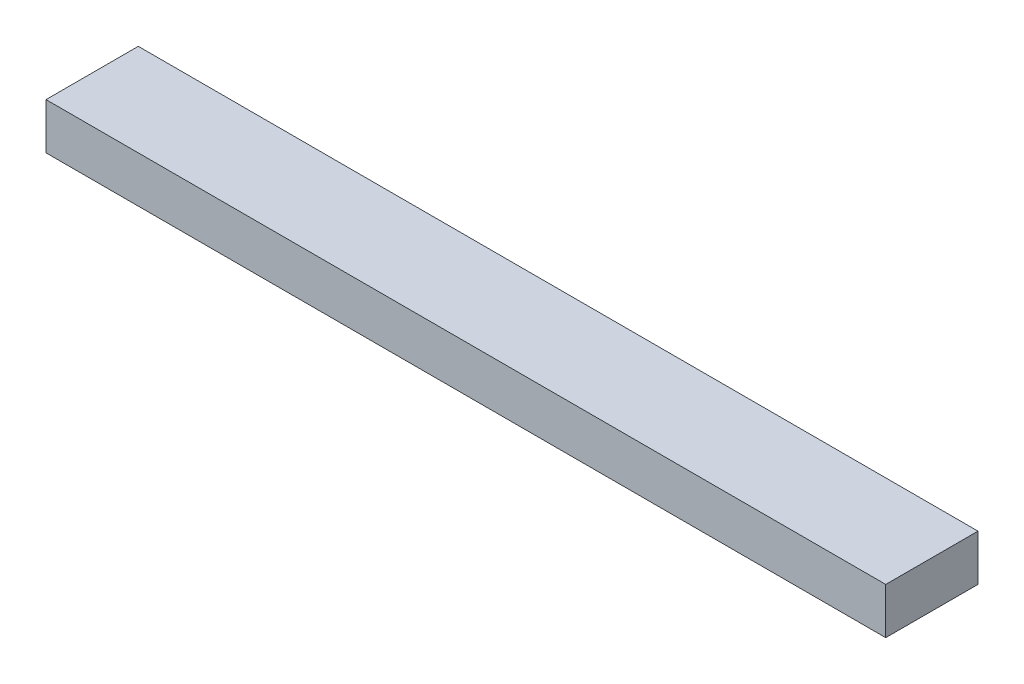
ISO-10303-21;
HEADER;
FILE_DESCRIPTION(('STEP AP214'),'2;1');
FILE_NAME('part.step','',(''),(''),'','','');
FILE_SCHEMA(('AUTOMOTIVE_DESIGN { 1 0 10303 214 1 1 1 1 }'));
ENDSEC;
DATA;
#1=APPLICATION_CONTEXT('core data for automotive mechanical design processes');
#2=APPLICATION_PROTOCOL_DEFINITION('international standard','automotive_design',2000,#1);
#3=PRODUCT_CONTEXT('',#1,'mechanical');
#4=PRODUCT('Part','Part','',(#3));
#5=PRODUCT_RELATED_PRODUCT_CATEGORY('part','',(#4));
#6=PRODUCT_DEFINITION_FORMATION('','',#4);
#7=PRODUCT_DEFINITION_CONTEXT('part definition',#1,'design');
#8=PRODUCT_DEFINITION('design','',#6,#7);
#9=PRODUCT_DEFINITION_SHAPE('','',#8);
#10=(LENGTH_UNIT() NAMED_UNIT(*) SI_UNIT(.MILLI.,.METRE.));
#11=(NAMED_UNIT(*) PLANE_ANGLE_UNIT() SI_UNIT($,.RADIAN.));
#12=(NAMED_UNIT(*) SI_UNIT($,.STERADIAN.) SOLID_ANGLE_UNIT());
#13=UNCERTAINTY_MEASURE_WITH_UNIT(LENGTH_MEASURE(1.E-05),#10,'distance_accuracy_value','');
#14=(GEOMETRIC_REPRESENTATION_CONTEXT(3) GLOBAL_UNCERTAINTY_ASSIGNED_CONTEXT((#13)) GLOBAL_UNIT_ASSIGNED_CONTEXT((#10,
#11,#12)) REPRESENTATION_CONTEXT('',''));
#15=CARTESIAN_POINT('',(0.,0.,0.));
#16=DIRECTION('',(0.,0.,1.));
#17=DIRECTION('',(1.,0.,0.));
#18=AXIS2_PLACEMENT_3D('',#15,#16,#17);
#19=CARTESIAN_POINT('',(57.785,6.35,6.35));
#20=DIRECTION('',(-1.,0.,0.));
#21=DIRECTION('',(0.,0.,1.));
#22=AXIS2_PLACEMENT_3D('',#19,#20,#21);
#23=PLANE('',#22);
#24=DIRECTION('',(0.,0.,-1.));
#25=VECTOR('',#24,1.);
#26=CARTESIAN_POINT('',(57.785,0.,6.35));
#27=LINE('',#26,#25);
#28=CARTESIAN_POINT('',(57.785,0.,6.35));
#29=VERTEX_POINT('',#28);
#30=CARTESIAN_POINT('',(57.785,0.,-6.35));
#31=VERTEX_POINT('',#30);
#32=EDGE_CURVE('E107',#29,#31,#27,.T.);
#33=ORIENTED_EDGE('',*,*,#32,.T.);
#34=DIRECTION('',(0.,-1.,0.));
#35=VECTOR('',#34,1.);
#36=CARTESIAN_POINT('',(57.785,6.35,-6.35));
#37=LINE('',#36,#35);
#38=CARTESIAN_POINT('',(57.785,6.35,-6.35));
#39=VERTEX_POINT('',#38);
#40=EDGE_CURVE('E11',#39,#31,#37,.T.);
#41=ORIENTED_EDGE('',*,*,#40,.F.);
#42=DIRECTION('',(0.,0.,-1.));
#43=VECTOR('',#42,1.);
#44=CARTESIAN_POINT('',(57.785,6.35,6.35));
#45=LINE('',#44,#43);
#46=CARTESIAN_POINT('',(57.785,6.35,6.35));
#47=VERTEX_POINT('',#46);
#48=EDGE_CURVE('E91',#47,#39,#45,.T.);
#49=ORIENTED_EDGE('',*,*,#48,.F.);
#50=DIRECTION('',(0.,-1.,0.));
#51=VECTOR('',#50,1.);
#52=CARTESIAN_POINT('',(57.785,6.35,6.35));
#53=LINE('',#52,#51);
#54=EDGE_CURVE('E103',#47,#29,#53,.T.);
#55=ORIENTED_EDGE('',*,*,#54,.T.);
#56=EDGE_LOOP('',(#33,#41,#49,#55));
#57=FACE_BOUND('',#56,.T.);
#58=ADVANCED_FACE('F39',(#57),#23,.F.);
#59=CARTESIAN_POINT('',(-57.785,6.35,-6.35));
#60=DIRECTION('',(0.,0.,1.));
#61=DIRECTION('',(1.,0.,0.));
#62=AXIS2_PLACEMENT_3D('',#59,#60,#61);
#63=PLANE('',#62);
#64=DIRECTION('',(-1.,0.,0.));
#65=VECTOR('',#64,1.);
#66=CARTESIAN_POINT('',(-57.785,0.,-6.35));
#67=LINE('',#66,#65);
#68=CARTESIAN_POINT('',(-57.785,0.,-6.35));
#69=VERTEX_POINT('',#68);
#70=EDGE_CURVE('E96',#31,#69,#67,.T.);
#71=ORIENTED_EDGE('',*,*,#70,.T.);
#72=DIRECTION('',(0.,-1.,0.));
#73=VECTOR('',#72,1.);
#74=CARTESIAN_POINT('',(-57.785,6.35,-6.35));
#75=LINE('',#74,#73);
#76=CARTESIAN_POINT('',(-57.785,6.35,-6.35));
#77=VERTEX_POINT('',#76);
#78=EDGE_CURVE('E48',#77,#69,#75,.T.);
#79=ORIENTED_EDGE('',*,*,#78,.F.);
#80=DIRECTION('',(-1.,0.,0.));
#81=VECTOR('',#80,1.);
#82=CARTESIAN_POINT('',(-57.785,6.35,-6.35));
#83=LINE('',#82,#81);
#84=EDGE_CURVE('E86',#39,#77,#83,.T.);
#85=ORIENTED_EDGE('',*,*,#84,.F.);
#86=ORIENTED_EDGE('',*,*,#40,.T.);
#87=EDGE_LOOP('',(#71,#79,#85,#86));
#88=FACE_BOUND('',#87,.T.);
#89=ADVANCED_FACE('F95',(#88),#63,.F.);
#90=CARTESIAN_POINT('',(-57.785,6.35,6.35));
#91=DIRECTION('',(1.,0.,0.));
#92=DIRECTION('',(0.,0.,-1.));
#93=AXIS2_PLACEMENT_3D('',#90,#91,#92);
#94=PLANE('',#93);
#95=DIRECTION('',(0.,0.,1.));
#96=VECTOR('',#95,1.);
#97=CARTESIAN_POINT('',(-57.785,0.,6.35));
#98=LINE('',#97,#96);
#99=CARTESIAN_POINT('',(-57.785,0.,6.35));
#100=VERTEX_POINT('',#99);
#101=EDGE_CURVE('E73',#69,#100,#98,.T.);
#102=ORIENTED_EDGE('',*,*,#101,.T.);
#103=DIRECTION('',(0.,-1.,0.));
#104=VECTOR('',#103,1.);
#105=CARTESIAN_POINT('',(-57.785,6.35,6.35));
#106=LINE('',#105,#104);
#107=CARTESIAN_POINT('',(-57.785,6.35,6.35));
#108=VERTEX_POINT('',#107);
#109=EDGE_CURVE('E98',#108,#100,#106,.T.);
#110=ORIENTED_EDGE('',*,*,#109,.F.);
#111=DIRECTION('',(0.,0.,1.));
#112=VECTOR('',#111,1.);
#113=CARTESIAN_POINT('',(-57.785,6.35,6.35));
#114=LINE('',#113,#112);
#115=EDGE_CURVE('E89',#77,#108,#114,.T.);
#116=ORIENTED_EDGE('',*,*,#115,.F.);
#117=ORIENTED_EDGE('',*,*,#78,.T.);
#118=EDGE_LOOP('',(#102,#110,#116,#117));
#119=FACE_BOUND('',#118,.T.);
#120=ADVANCED_FACE('F99',(#119),#94,.F.);
#121=CARTESIAN_POINT('',(-57.785,6.35,6.35));
#122=DIRECTION('',(0.,0.,-1.));
#123=DIRECTION('',(-1.,0.,0.));
#124=AXIS2_PLACEMENT_3D('',#121,#122,#123);
#125=PLANE('',#124);
#126=DIRECTION('',(1.,0.,0.));
#127=VECTOR('',#126,1.);
#128=CARTESIAN_POINT('',(-57.785,0.,6.35));
#129=LINE('',#128,#127);
#130=EDGE_CURVE('E79',#100,#29,#129,.T.);
#131=ORIENTED_EDGE('',*,*,#130,.T.);
#132=ORIENTED_EDGE('',*,*,#54,.F.);
#133=DIRECTION('',(1.,0.,0.));
#134=VECTOR('',#133,1.);
#135=CARTESIAN_POINT('',(-57.785,6.35,6.35));
#136=LINE('',#135,#134);
#137=EDGE_CURVE('E56',#108,#47,#136,.T.);
#138=ORIENTED_EDGE('',*,*,#137,.F.);
#139=ORIENTED_EDGE('',*,*,#109,.T.);
#140=EDGE_LOOP('',(#131,#132,#138,#139));
#141=FACE_BOUND('',#140,.T.);
#142=ADVANCED_FACE('F120',(#141),#125,.F.);
#143=CARTESIAN_POINT('',(0.,6.35,0.));
#144=DIRECTION('',(0.,-1.,0.));
#145=DIRECTION('',(0.,0.,-1.));
#146=AXIS2_PLACEMENT_3D('',#143,#144,#145);
#147=PLANE('',#146);
#148=ORIENTED_EDGE('',*,*,#48,.T.);
#149=ORIENTED_EDGE('',*,*,#84,.T.);
#150=ORIENTED_EDGE('',*,*,#115,.T.);
#151=ORIENTED_EDGE('',*,*,#137,.T.);
#152=EDGE_LOOP('',(#148,#149,#150,#151));
#153=FACE_BOUND('',#152,.T.);
#154=ADVANCED_FACE('F87',(#153),#147,.F.);
#155=CARTESIAN_POINT('',(0.,0.,0.));
#156=DIRECTION('',(0.,-1.,0.));
#157=DIRECTION('',(0.,0.,-1.));
#158=AXIS2_PLACEMENT_3D('',#155,#156,#157);
#159=PLANE('',#158);
#160=ORIENTED_EDGE('',*,*,#32,.F.);
#161=ORIENTED_EDGE('',*,*,#130,.F.);
#162=ORIENTED_EDGE('',*,*,#101,.F.);
#163=ORIENTED_EDGE('',*,*,#70,.F.);
#164=EDGE_LOOP('',(#160,#161,#162,#163));
#165=FACE_BOUND('',#164,.T.);
#166=ADVANCED_FACE('F123',(#165),#159,.T.);
#167=CLOSED_SHELL('',(#58,#89,#120,#142,#154,#166));
#168=MANIFOLD_SOLID_BREP('B2',#167);
#169=ADVANCED_BREP_SHAPE_REPRESENTATION('',(#18,#168),#14);
#170=SHAPE_DEFINITION_REPRESENTATION(#9,#169);
ENDSEC;
END-ISO-10303-21;
